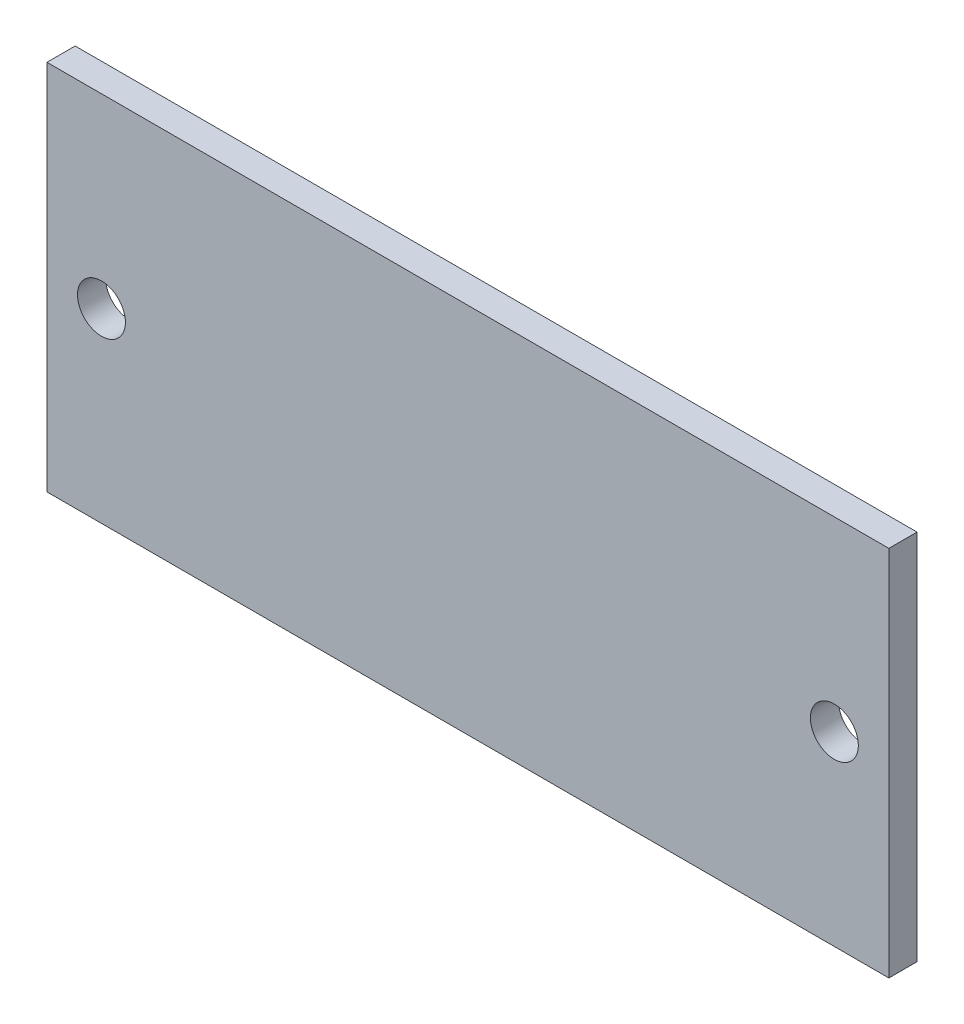
ISO-10303-21;
HEADER;
FILE_DESCRIPTION(('STEP AP214'),'2;1');
FILE_NAME('part.step','',(''),(''),'','','');
FILE_SCHEMA(('AUTOMOTIVE_DESIGN { 1 0 10303 214 1 1 1 1 }'));
ENDSEC;
DATA;
#1=APPLICATION_CONTEXT('core data for automotive mechanical design processes');
#2=APPLICATION_PROTOCOL_DEFINITION('international standard','automotive_design',2000,#1);
#3=PRODUCT_CONTEXT('',#1,'mechanical');
#4=PRODUCT('Part','Part','',(#3));
#5=PRODUCT_RELATED_PRODUCT_CATEGORY('part','',(#4));
#6=PRODUCT_DEFINITION_FORMATION('','',#4);
#7=PRODUCT_DEFINITION_CONTEXT('part definition',#1,'design');
#8=PRODUCT_DEFINITION('design','',#6,#7);
#9=PRODUCT_DEFINITION_SHAPE('','',#8);
#10=(LENGTH_UNIT() NAMED_UNIT(*) SI_UNIT(.MILLI.,.METRE.));
#11=(NAMED_UNIT(*) PLANE_ANGLE_UNIT() SI_UNIT($,.RADIAN.));
#12=(NAMED_UNIT(*) SI_UNIT($,.STERADIAN.) SOLID_ANGLE_UNIT());
#13=UNCERTAINTY_MEASURE_WITH_UNIT(LENGTH_MEASURE(1.E-05),#10,'distance_accuracy_value','');
#14=(GEOMETRIC_REPRESENTATION_CONTEXT(3) GLOBAL_UNCERTAINTY_ASSIGNED_CONTEXT((#13)) GLOBAL_UNIT_ASSIGNED_CONTEXT((#10,
#11,#12)) REPRESENTATION_CONTEXT('',''));
#15=CARTESIAN_POINT('',(0.,0.,0.));
#16=DIRECTION('',(0.,0.,1.));
#17=DIRECTION('',(1.,0.,0.));
#18=AXIS2_PLACEMENT_3D('',#15,#16,#17);
#19=CARTESIAN_POINT('',(22.4,9.9,1.5));
#20=DIRECTION('',(-1.,0.,0.));
#21=DIRECTION('',(0.,-1.,0.));
#22=AXIS2_PLACEMENT_3D('',#19,#20,#21);
#23=PLANE('',#22);
#24=DIRECTION('',(0.,1.,0.));
#25=VECTOR('',#24,1.);
#26=CARTESIAN_POINT('',(22.4,9.9,0.));
#27=LINE('',#26,#25);
#28=CARTESIAN_POINT('',(22.4,-9.9,0.));
#29=VERTEX_POINT('',#28);
#30=CARTESIAN_POINT('',(22.4,9.9,0.));
#31=VERTEX_POINT('',#30);
#32=EDGE_CURVE('E106',#29,#31,#27,.T.);
#33=ORIENTED_EDGE('',*,*,#32,.T.);
#34=DIRECTION('',(0.,0.,-1.));
#35=VECTOR('',#34,1.);
#36=CARTESIAN_POINT('',(22.4,9.9,1.5));
#37=LINE('',#36,#35);
#38=CARTESIAN_POINT('',(22.4,9.9,1.5));
#39=VERTEX_POINT('',#38);
#40=EDGE_CURVE('E11',#39,#31,#37,.T.);
#41=ORIENTED_EDGE('',*,*,#40,.F.);
#42=DIRECTION('',(0.,1.,0.));
#43=VECTOR('',#42,1.);
#44=CARTESIAN_POINT('',(22.4,9.9,1.5));
#45=LINE('',#44,#43);
#46=CARTESIAN_POINT('',(22.4,-9.9,1.5));
#47=VERTEX_POINT('',#46);
#48=EDGE_CURVE('E94',#47,#39,#45,.T.);
#49=ORIENTED_EDGE('',*,*,#48,.F.);
#50=DIRECTION('',(0.,0.,-1.));
#51=VECTOR('',#50,1.);
#52=CARTESIAN_POINT('',(22.4,-9.9,1.5));
#53=LINE('',#52,#51);
#54=EDGE_CURVE('E102',#47,#29,#53,.T.);
#55=ORIENTED_EDGE('',*,*,#54,.T.);
#56=EDGE_LOOP('',(#33,#41,#49,#55));
#57=FACE_BOUND('',#56,.T.);
#58=ADVANCED_FACE('F43',(#57),#23,.F.);
#59=CARTESIAN_POINT('',(-22.4,9.9,1.5));
#60=DIRECTION('',(0.,-1.,0.));
#61=DIRECTION('',(0.,0.,-1.));
#62=AXIS2_PLACEMENT_3D('',#59,#60,#61);
#63=PLANE('',#62);
#64=DIRECTION('',(-1.,0.,0.));
#65=VECTOR('',#64,1.);
#66=CARTESIAN_POINT('',(-22.4,9.9,0.));
#67=LINE('',#66,#65);
#68=CARTESIAN_POINT('',(-22.4,9.9,0.));
#69=VERTEX_POINT('',#68);
#70=EDGE_CURVE('E98',#31,#69,#67,.T.);
#71=ORIENTED_EDGE('',*,*,#70,.T.);
#72=DIRECTION('',(0.,0.,-1.));
#73=VECTOR('',#72,1.);
#74=CARTESIAN_POINT('',(-22.4,9.9,1.5));
#75=LINE('',#74,#73);
#76=CARTESIAN_POINT('',(-22.4,9.9,1.5));
#77=VERTEX_POINT('',#76);
#78=EDGE_CURVE('E51',#77,#69,#75,.T.);
#79=ORIENTED_EDGE('',*,*,#78,.F.);
#80=DIRECTION('',(-1.,0.,0.));
#81=VECTOR('',#80,1.);
#82=CARTESIAN_POINT('',(-22.4,9.9,1.5));
#83=LINE('',#82,#81);
#84=EDGE_CURVE('E89',#39,#77,#83,.T.);
#85=ORIENTED_EDGE('',*,*,#84,.F.);
#86=ORIENTED_EDGE('',*,*,#40,.T.);
#87=EDGE_LOOP('',(#71,#79,#85,#86));
#88=FACE_BOUND('',#87,.T.);
#89=ADVANCED_FACE('F97',(#88),#63,.F.);
#90=CARTESIAN_POINT('',(-22.4,9.9,1.5));
#91=DIRECTION('',(1.,0.,0.));
#92=DIRECTION('',(0.,0.,-1.));
#93=AXIS2_PLACEMENT_3D('',#90,#91,#92);
#94=PLANE('',#93);
#95=DIRECTION('',(0.,-1.,0.));
#96=VECTOR('',#95,1.);
#97=CARTESIAN_POINT('',(-22.4,9.9,0.));
#98=LINE('',#97,#96);
#99=CARTESIAN_POINT('',(-22.4,-9.9,0.));
#100=VERTEX_POINT('',#99);
#101=EDGE_CURVE('E76',#69,#100,#98,.T.);
#102=ORIENTED_EDGE('',*,*,#101,.T.);
#103=DIRECTION('',(0.,0.,-1.));
#104=VECTOR('',#103,1.);
#105=CARTESIAN_POINT('',(-22.4,-9.9,1.5));
#106=LINE('',#105,#104);
#107=CARTESIAN_POINT('',(-22.4,-9.9,1.5));
#108=VERTEX_POINT('',#107);
#109=EDGE_CURVE('E99',#108,#100,#106,.T.);
#110=ORIENTED_EDGE('',*,*,#109,.F.);
#111=DIRECTION('',(0.,-1.,0.));
#112=VECTOR('',#111,1.);
#113=CARTESIAN_POINT('',(-22.4,9.9,1.5));
#114=LINE('',#113,#112);
#115=EDGE_CURVE('E92',#77,#108,#114,.T.);
#116=ORIENTED_EDGE('',*,*,#115,.F.);
#117=ORIENTED_EDGE('',*,*,#78,.T.);
#118=EDGE_LOOP('',(#102,#110,#116,#117));
#119=FACE_BOUND('',#118,.T.);
#120=ADVANCED_FACE('F100',(#119),#94,.F.);
#121=CARTESIAN_POINT('',(-22.4,-9.9,1.5));
#122=DIRECTION('',(0.,1.,0.));
#123=DIRECTION('',(0.,0.,1.));
#124=AXIS2_PLACEMENT_3D('',#121,#122,#123);
#125=PLANE('',#124);
#126=DIRECTION('',(1.,0.,0.));
#127=VECTOR('',#126,1.);
#128=CARTESIAN_POINT('',(-22.4,-9.9,0.));
#129=LINE('',#128,#127);
#130=EDGE_CURVE('E82',#100,#29,#129,.T.);
#131=ORIENTED_EDGE('',*,*,#130,.T.);
#132=ORIENTED_EDGE('',*,*,#54,.F.);
#133=DIRECTION('',(1.,0.,0.));
#134=VECTOR('',#133,1.);
#135=CARTESIAN_POINT('',(-22.4,-9.9,1.5));
#136=LINE('',#135,#134);
#137=EDGE_CURVE('E59',#108,#47,#136,.T.);
#138=ORIENTED_EDGE('',*,*,#137,.F.);
#139=ORIENTED_EDGE('',*,*,#109,.T.);
#140=EDGE_LOOP('',(#131,#132,#138,#139));
#141=FACE_BOUND('',#140,.T.);
#142=ADVANCED_FACE('F114',(#141),#125,.F.);
#143=CARTESIAN_POINT('',(0.,0.,1.5));
#144=DIRECTION('',(0.,0.,1.));
#145=DIRECTION('',(1.,0.,0.));
#146=AXIS2_PLACEMENT_3D('',#143,#144,#145);
#147=PLANE('',#146);
#148=CARTESIAN_POINT('',(19.5,0.,1.5));
#149=DIRECTION('',(0.,0.,-1.));
#150=DIRECTION('',(-1.,0.,0.));
#151=AXIS2_PLACEMENT_3D('',#148,#149,#150);
#152=CIRCLE('',#151,1.275);
#153=CARTESIAN_POINT('',(18.225,0.,1.5));
#154=VERTEX_POINT('',#153);
#155=EDGE_CURVE('E126',#154,#154,#152,.T.);
#156=ORIENTED_EDGE('',*,*,#155,.T.);
#157=EDGE_LOOP('',(#156));
#158=FACE_BOUND('',#157,.T.);
#159=CARTESIAN_POINT('',(-19.5,0.,1.5));
#160=DIRECTION('',(0.,0.,1.));
#161=DIRECTION('',(1.,0.,0.));
#162=AXIS2_PLACEMENT_3D('',#159,#160,#161);
#163=CIRCLE('',#162,1.275);
#164=CARTESIAN_POINT('',(-18.225,0.,1.5));
#165=VERTEX_POINT('',#164);
#166=EDGE_CURVE('E120',#165,#165,#163,.T.);
#167=ORIENTED_EDGE('',*,*,#166,.F.);
#168=EDGE_LOOP('',(#167));
#169=FACE_BOUND('',#168,.T.);
#170=ORIENTED_EDGE('',*,*,#48,.T.);
#171=ORIENTED_EDGE('',*,*,#84,.T.);
#172=ORIENTED_EDGE('',*,*,#115,.T.);
#173=ORIENTED_EDGE('',*,*,#137,.T.);
#174=EDGE_LOOP('',(#170,#171,#172,#173));
#175=FACE_BOUND('',#174,.T.);
#176=ADVANCED_FACE('F90',(#158,#169,#175),#147,.T.);
#177=CARTESIAN_POINT('',(0.,0.,0.));
#178=DIRECTION('',(0.,0.,1.));
#179=DIRECTION('',(1.,0.,0.));
#180=AXIS2_PLACEMENT_3D('',#177,#178,#179);
#181=PLANE('',#180);
#182=CARTESIAN_POINT('',(19.5,0.,0.));
#183=DIRECTION('',(0.,0.,-1.));
#184=DIRECTION('',(-1.,0.,0.));
#185=AXIS2_PLACEMENT_3D('',#182,#183,#184);
#186=CIRCLE('',#185,1.275);
#187=CARTESIAN_POINT('',(18.225,0.,0.));
#188=VERTEX_POINT('',#187);
#189=EDGE_CURVE('E123',#188,#188,#186,.T.);
#190=ORIENTED_EDGE('',*,*,#189,.F.);
#191=EDGE_LOOP('',(#190));
#192=FACE_BOUND('',#191,.T.);
#193=CARTESIAN_POINT('',(-19.5,0.,0.));
#194=DIRECTION('',(0.,0.,1.));
#195=DIRECTION('',(1.,0.,0.));
#196=AXIS2_PLACEMENT_3D('',#193,#194,#195);
#197=CIRCLE('',#196,1.275);
#198=CARTESIAN_POINT('',(-18.225,0.,0.));
#199=VERTEX_POINT('',#198);
#200=EDGE_CURVE('E109',#199,#199,#197,.T.);
#201=ORIENTED_EDGE('',*,*,#200,.T.);
#202=EDGE_LOOP('',(#201));
#203=FACE_BOUND('',#202,.T.);
#204=ORIENTED_EDGE('',*,*,#32,.F.);
#205=ORIENTED_EDGE('',*,*,#130,.F.);
#206=ORIENTED_EDGE('',*,*,#101,.F.);
#207=ORIENTED_EDGE('',*,*,#70,.F.);
#208=EDGE_LOOP('',(#204,#205,#206,#207));
#209=FACE_BOUND('',#208,.T.);
#210=ADVANCED_FACE('F117',(#192,#203,#209),#181,.F.);
#211=CARTESIAN_POINT('',(-19.5,0.,0.));
#212=DIRECTION('',(0.,0.,1.));
#213=DIRECTION('',(1.,0.,0.));
#214=AXIS2_PLACEMENT_3D('',#211,#212,#213);
#215=CYLINDRICAL_SURFACE('',#214,1.275);
#216=ORIENTED_EDGE('',*,*,#200,.F.);
#217=EDGE_LOOP('',(#216));
#218=FACE_BOUND('',#217,.T.);
#219=ORIENTED_EDGE('',*,*,#166,.T.);
#220=EDGE_LOOP('',(#219));
#221=FACE_BOUND('',#220,.T.);
#222=ADVANCED_FACE('F137',(#218,#221),#215,.F.);
#223=CARTESIAN_POINT('',(19.5,0.,0.));
#224=DIRECTION('',(0.,0.,1.));
#225=DIRECTION('',(1.,0.,0.));
#226=AXIS2_PLACEMENT_3D('',#223,#224,#225);
#227=CYLINDRICAL_SURFACE('',#226,1.275);
#228=ORIENTED_EDGE('',*,*,#189,.T.);
#229=EDGE_LOOP('',(#228));
#230=FACE_BOUND('',#229,.T.);
#231=ORIENTED_EDGE('',*,*,#155,.F.);
#232=EDGE_LOOP('',(#231));
#233=FACE_BOUND('',#232,.T.);
#234=ADVANCED_FACE('F132',(#230,#233),#227,.F.);
#235=CLOSED_SHELL('',(#58,#89,#120,#142,#176,#210,#222,#234));
#236=MANIFOLD_SOLID_BREP('B2',#235);
#237=ADVANCED_BREP_SHAPE_REPRESENTATION('',(#18,#236),#14);
#238=SHAPE_DEFINITION_REPRESENTATION(#9,#237);
ENDSEC;
END-ISO-10303-21;
